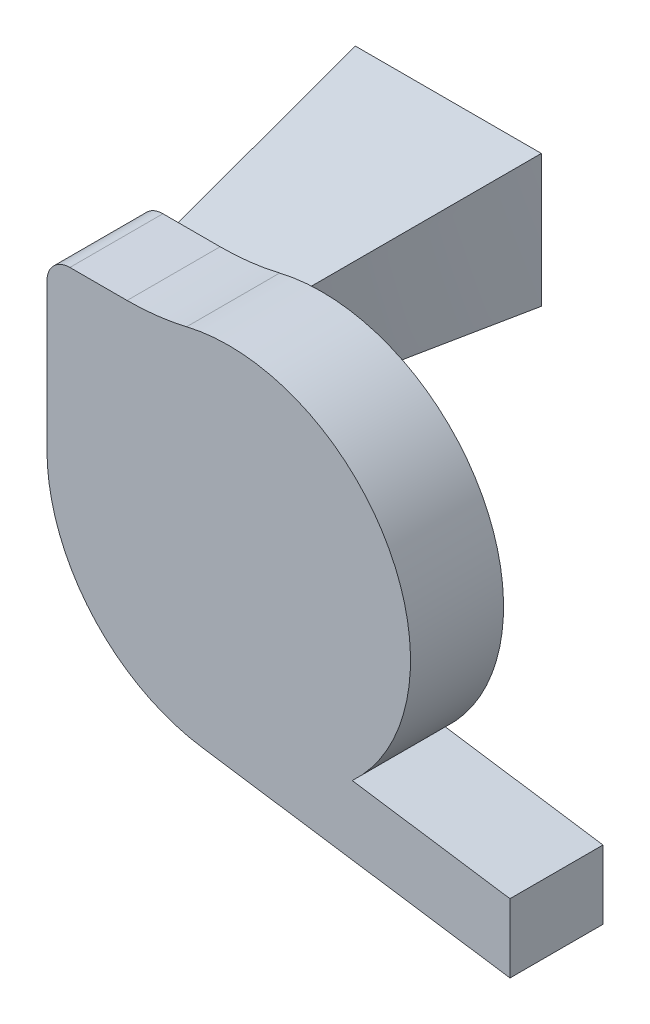
ISO-10303-21;
HEADER;
FILE_DESCRIPTION(('STEP AP214'),'2;1');
FILE_NAME('part.step','',(''),(''),'','','');
FILE_SCHEMA(('AUTOMOTIVE_DESIGN { 1 0 10303 214 1 1 1 1 }'));
ENDSEC;
DATA;
#1=APPLICATION_CONTEXT('core data for automotive mechanical design processes');
#2=APPLICATION_PROTOCOL_DEFINITION('international standard','automotive_design',2000,#1);
#3=PRODUCT_CONTEXT('',#1,'mechanical');
#4=PRODUCT('Part','Part','',(#3));
#5=PRODUCT_RELATED_PRODUCT_CATEGORY('part','',(#4));
#6=PRODUCT_DEFINITION_FORMATION('','',#4);
#7=PRODUCT_DEFINITION_CONTEXT('part definition',#1,'design');
#8=PRODUCT_DEFINITION('design','',#6,#7);
#9=PRODUCT_DEFINITION_SHAPE('','',#8);
#10=(LENGTH_UNIT() NAMED_UNIT(*) SI_UNIT(.MILLI.,.METRE.));
#11=(NAMED_UNIT(*) PLANE_ANGLE_UNIT() SI_UNIT($,.RADIAN.));
#12=(NAMED_UNIT(*) SI_UNIT($,.STERADIAN.) SOLID_ANGLE_UNIT());
#13=UNCERTAINTY_MEASURE_WITH_UNIT(LENGTH_MEASURE(1.E-05),#10,'distance_accuracy_value','');
#14=(GEOMETRIC_REPRESENTATION_CONTEXT(3) GLOBAL_UNCERTAINTY_ASSIGNED_CONTEXT((#13)) GLOBAL_UNIT_ASSIGNED_CONTEXT((#10,
#11,#12)) REPRESENTATION_CONTEXT('',''));
#15=CARTESIAN_POINT('',(0.,0.,0.));
#16=DIRECTION('',(0.,0.,1.));
#17=DIRECTION('',(1.,0.,0.));
#18=AXIS2_PLACEMENT_3D('',#15,#16,#17);
#19=CARTESIAN_POINT('',(128.,-103.,707.));
#20=DIRECTION('',(0.,0.,-1.));
#21=DIRECTION('',(-1.,0.,0.));
#22=AXIS2_PLACEMENT_3D('',#19,#20,#21);
#23=PLANE('',#22);
#24=DIRECTION('',(0.,-1.,0.));
#25=VECTOR('',#24,1.);
#26=CARTESIAN_POINT('',(521.006513991805,-418.097434556668,707.));
#27=LINE('',#26,#25);
#28=CARTESIAN_POINT('',(521.006513991806,-322.097434556668,707.));
#29=VERTEX_POINT('',#28);
#30=CARTESIAN_POINT('',(521.006513991805,-418.097434556668,707.));
#31=VERTEX_POINT('',#30);
#32=EDGE_CURVE('E262',#29,#31,#27,.T.);
#33=ORIENTED_EDGE('',*,*,#32,.T.);
#34=DIRECTION('',(-0.989169442590769,0.146778110918038,0.));
#35=VECTOR('',#34,1.);
#36=CARTESIAN_POINT('',(90.7183598268185,-354.249038418055,707.));
#37=LINE('',#36,#35);
#38=CARTESIAN_POINT('',(90.7183598268185,-354.249038418055,707.));
#39=VERTEX_POINT('',#38);
#40=EDGE_CURVE('E266',#31,#39,#37,.T.);
#41=ORIENTED_EDGE('',*,*,#40,.T.);
#42=CARTESIAN_POINT('',(128.,-103.,707.));
#43=DIRECTION('',(0.,0.,-1.));
#44=DIRECTION('',(-1.,0.,0.));
#45=AXIS2_PLACEMENT_3D('',#42,#43,#44);
#46=CIRCLE('',#45,254.);
#47=CARTESIAN_POINT('',(-126.,-103.,707.));
#48=VERTEX_POINT('',#47);
#49=EDGE_CURVE('E271',#39,#48,#46,.T.);
#50=ORIENTED_EDGE('',*,*,#49,.T.);
#51=DIRECTION('',(0.,1.,0.));
#52=VECTOR('',#51,1.);
#53=CARTESIAN_POINT('',(-126.,-103.,707.));
#54=LINE('',#53,#52);
#55=CARTESIAN_POINT('',(-126.,102.31037281145,707.));
#56=VERTEX_POINT('',#55);
#57=EDGE_CURVE('E275',#48,#56,#54,.T.);
#58=ORIENTED_EDGE('',*,*,#57,.T.);
#59=CARTESIAN_POINT('',(-94.,102.31037281145,707.));
#60=DIRECTION('',(0.,0.,-1.));
#61=DIRECTION('',(-1.,0.,0.));
#62=AXIS2_PLACEMENT_3D('',#59,#60,#61);
#63=CIRCLE('',#62,32.);
#64=CARTESIAN_POINT('',(-94.,134.31037281145,707.));
#65=VERTEX_POINT('',#64);
#66=EDGE_CURVE('E279',#56,#65,#63,.T.);
#67=ORIENTED_EDGE('',*,*,#66,.T.);
#68=DIRECTION('',(1.,0.,0.));
#69=VECTOR('',#68,1.);
#70=CARTESIAN_POINT('',(-94.,134.31037281145,707.));
#71=LINE('',#70,#69);
#72=CARTESIAN_POINT('',(-14.0739402088401,134.31037281145,707.));
#73=VERTEX_POINT('',#72);
#74=EDGE_CURVE('E283',#65,#73,#71,.T.);
#75=ORIENTED_EDGE('',*,*,#74,.T.);
#76=CARTESIAN_POINT('',(-14.07394020884,493.372243845825,707.));
#77=DIRECTION('',(0.,0.,1.));
#78=DIRECTION('',(1.,0.,0.));
#79=AXIS2_PLACEMENT_3D('',#76,#77,#78);
#80=CIRCLE('',#79,359.061871034375);
#81=CARTESIAN_POINT('',(69.1368044270006,144.08525695989,707.));
#82=VERTEX_POINT('',#81);
#83=EDGE_CURVE('E287',#73,#82,#80,.T.);
#84=ORIENTED_EDGE('',*,*,#83,.T.);
#85=CARTESIAN_POINT('',(128.,-103.,707.));
#86=DIRECTION('',(0.,0.,-1.));
#87=DIRECTION('',(-1.,0.,0.));
#88=AXIS2_PLACEMENT_3D('',#85,#86,#87);
#89=CIRCLE('',#88,254.);
#90=CARTESIAN_POINT('',(300.557862014574,-289.386116052026,707.));
#91=VERTEX_POINT('',#90);
#92=EDGE_CURVE('E234',#82,#91,#89,.T.);
#93=ORIENTED_EDGE('',*,*,#92,.T.);
#94=DIRECTION('',(0.989169442590769,-0.146778110918038,0.));
#95=VECTOR('',#94,1.);
#96=CARTESIAN_POINT('',(521.006513991806,-322.097434556668,707.));
#97=LINE('',#96,#95);
#98=EDGE_CURVE('E292',#91,#29,#97,.T.);
#99=ORIENTED_EDGE('',*,*,#98,.T.);
#100=EDGE_LOOP('',(#33,#41,#50,#58,#67,#75,#84,#93,#99));
#101=FACE_BOUND('',#100,.T.);
#102=DIRECTION('',(-1.,0.,0.));
#103=VECTOR('',#102,1.);
#104=CARTESIAN_POINT('',(44.8216487915123,-38.2997440494397,707.));
#105=LINE('',#104,#103);
#106=CARTESIAN_POINT('',(44.8216487915123,-38.2997440494397,707.));
#107=VERTEX_POINT('',#106);
#108=CARTESIAN_POINT('',(-85.1783512084866,-38.2997440494397,707.));
#109=VERTEX_POINT('',#108);
#110=EDGE_CURVE('E315',#107,#109,#105,.T.);
#111=ORIENTED_EDGE('',*,*,#110,.F.);
#112=DIRECTION('',(-0.110431526074847,-0.993883734673619,0.));
#113=VECTOR('',#112,1.);
#114=CARTESIAN_POINT('',(44.8216487915123,-38.2997440494397,707.));
#115=LINE('',#114,#113);
#116=CARTESIAN_POINT('',(59.8216487915123,96.7002559505603,707.));
#117=VERTEX_POINT('',#116);
#118=EDGE_CURVE('E326',#117,#107,#115,.T.);
#119=ORIENTED_EDGE('',*,*,#118,.F.);
#120=DIRECTION('',(1.,0.,0.));
#121=VECTOR('',#120,1.);
#122=CARTESIAN_POINT('',(59.8216487915123,96.7002559505603,707.));
#123=LINE('',#122,#121);
#124=CARTESIAN_POINT('',(-100.178351208487,96.7002559505603,707.));
#125=VERTEX_POINT('',#124);
#126=EDGE_CURVE('E322',#125,#117,#123,.T.);
#127=ORIENTED_EDGE('',*,*,#126,.F.);
#128=DIRECTION('',(-0.110431526074846,0.993883734673619,0.));
#129=VECTOR('',#128,1.);
#130=CARTESIAN_POINT('',(-85.1783512084866,-38.2997440494397,707.));
#131=LINE('',#130,#129);
#132=EDGE_CURVE('E319',#109,#125,#131,.T.);
#133=ORIENTED_EDGE('',*,*,#132,.F.);
#134=EDGE_LOOP('',(#111,#119,#127,#133));
#135=FACE_BOUND('',#134,.T.);
#136=ADVANCED_FACE('F139',(#101,#135),#23,.T.);
#137=CARTESIAN_POINT('',(521.006513991805,-418.097434556668,837.));
#138=DIRECTION('',(1.,0.,0.));
#139=DIRECTION('',(0.,1.,0.));
#140=AXIS2_PLACEMENT_3D('',#137,#138,#139);
#141=PLANE('',#140);
#142=ORIENTED_EDGE('',*,*,#32,.F.);
#143=DIRECTION('',(0.,0.,-1.));
#144=VECTOR('',#143,1.);
#145=CARTESIAN_POINT('',(521.006513991806,-322.097434556668,837.));
#146=LINE('',#145,#144);
#147=CARTESIAN_POINT('',(521.006513991806,-322.097434556668,837.));
#148=VERTEX_POINT('',#147);
#149=EDGE_CURVE('E13',#148,#29,#146,.T.);
#150=ORIENTED_EDGE('',*,*,#149,.F.);
#151=DIRECTION('',(0.,-1.,0.));
#152=VECTOR('',#151,1.);
#153=CARTESIAN_POINT('',(521.006513991805,-418.097434556668,837.));
#154=LINE('',#153,#152);
#155=CARTESIAN_POINT('',(521.006513991805,-418.097434556668,837.));
#156=VERTEX_POINT('',#155);
#157=EDGE_CURVE('E295',#148,#156,#154,.T.);
#158=ORIENTED_EDGE('',*,*,#157,.T.);
#159=DIRECTION('',(0.,0.,-1.));
#160=VECTOR('',#159,1.);
#161=CARTESIAN_POINT('',(521.006513991805,-418.097434556668,837.));
#162=LINE('',#161,#160);
#163=EDGE_CURVE('E206',#156,#31,#162,.T.);
#164=ORIENTED_EDGE('',*,*,#163,.T.);
#165=EDGE_LOOP('',(#142,#150,#158,#164));
#166=FACE_BOUND('',#165,.T.);
#167=ADVANCED_FACE('F141',(#166),#141,.T.);
#168=CARTESIAN_POINT('',(521.006513991806,-322.097434556668,837.));
#169=DIRECTION('',(0.146778110918038,0.989169442590769,0.));
#170=DIRECTION('',(-0.989169442590769,0.146778110918038,0.));
#171=AXIS2_PLACEMENT_3D('',#168,#169,#170);
#172=PLANE('',#171);
#173=ORIENTED_EDGE('',*,*,#98,.F.);
#174=DIRECTION('',(0.,0.,-1.));
#175=VECTOR('',#174,1.);
#176=CARTESIAN_POINT('',(300.557862014574,-289.386116052026,837.));
#177=LINE('',#176,#175);
#178=CARTESIAN_POINT('',(300.557862014574,-289.386116052026,837.));
#179=VERTEX_POINT('',#178);
#180=EDGE_CURVE('E149',#179,#91,#177,.T.);
#181=ORIENTED_EDGE('',*,*,#180,.F.);
#182=DIRECTION('',(0.989169442590769,-0.146778110918038,0.));
#183=VECTOR('',#182,1.);
#184=CARTESIAN_POINT('',(521.006513991806,-322.097434556668,837.));
#185=LINE('',#184,#183);
#186=EDGE_CURVE('E248',#179,#148,#185,.T.);
#187=ORIENTED_EDGE('',*,*,#186,.T.);
#188=ORIENTED_EDGE('',*,*,#149,.T.);
#189=EDGE_LOOP('',(#173,#181,#187,#188));
#190=FACE_BOUND('',#189,.T.);
#191=ADVANCED_FACE('F509',(#190),#172,.T.);
#192=CARTESIAN_POINT('',(128.,-103.,837.));
#193=DIRECTION('',(0.,0.,-1.));
#194=DIRECTION('',(-1.,0.,0.));
#195=AXIS2_PLACEMENT_3D('',#192,#193,#194);
#196=CYLINDRICAL_SURFACE('',#195,254.);
#197=ORIENTED_EDGE('',*,*,#92,.F.);
#198=DIRECTION('',(0.,0.,-1.));
#199=VECTOR('',#198,1.);
#200=CARTESIAN_POINT('',(69.1368044270006,144.08525695989,837.));
#201=LINE('',#200,#199);
#202=CARTESIAN_POINT('',(69.1368044270006,144.08525695989,837.));
#203=VERTEX_POINT('',#202);
#204=EDGE_CURVE('E228',#203,#82,#201,.T.);
#205=ORIENTED_EDGE('',*,*,#204,.F.);
#206=CARTESIAN_POINT('',(128.,-103.,837.));
#207=DIRECTION('',(0.,0.,-1.));
#208=DIRECTION('',(-1.,0.,0.));
#209=AXIS2_PLACEMENT_3D('',#206,#207,#208);
#210=CIRCLE('',#209,254.);
#211=EDGE_CURVE('E231',#203,#179,#210,.T.);
#212=ORIENTED_EDGE('',*,*,#211,.T.);
#213=ORIENTED_EDGE('',*,*,#180,.T.);
#214=EDGE_LOOP('',(#197,#205,#212,#213));
#215=FACE_BOUND('',#214,.T.);
#216=ADVANCED_FACE('F230',(#215),#196,.T.);
#217=CARTESIAN_POINT('',(-14.07394020884,493.372243845825,837.));
#218=DIRECTION('',(0.,0.,-1.));
#219=DIRECTION('',(-1.,0.,0.));
#220=AXIS2_PLACEMENT_3D('',#217,#218,#219);
#221=CYLINDRICAL_SURFACE('',#220,359.061871034375);
#222=ORIENTED_EDGE('',*,*,#83,.F.);
#223=DIRECTION('',(0.,0.,-1.));
#224=VECTOR('',#223,1.);
#225=CARTESIAN_POINT('',(-14.0739402088401,134.31037281145,837.));
#226=LINE('',#225,#224);
#227=CARTESIAN_POINT('',(-14.0739402088401,134.31037281145,837.));
#228=VERTEX_POINT('',#227);
#229=EDGE_CURVE('E240',#228,#73,#226,.T.);
#230=ORIENTED_EDGE('',*,*,#229,.F.);
#231=CARTESIAN_POINT('',(-14.07394020884,493.372243845825,837.));
#232=DIRECTION('',(0.,0.,1.));
#233=DIRECTION('',(1.,0.,0.));
#234=AXIS2_PLACEMENT_3D('',#231,#232,#233);
#235=CIRCLE('',#234,359.061871034375);
#236=EDGE_CURVE('E246',#228,#203,#235,.T.);
#237=ORIENTED_EDGE('',*,*,#236,.T.);
#238=ORIENTED_EDGE('',*,*,#204,.T.);
#239=EDGE_LOOP('',(#222,#230,#237,#238));
#240=FACE_BOUND('',#239,.T.);
#241=ADVANCED_FACE('F251',(#240),#221,.F.);
#242=CARTESIAN_POINT('',(-94.,134.31037281145,837.));
#243=DIRECTION('',(0.,1.,0.));
#244=DIRECTION('',(-1.,0.,0.));
#245=AXIS2_PLACEMENT_3D('',#242,#243,#244);
#246=PLANE('',#245);
#247=ORIENTED_EDGE('',*,*,#74,.F.);
#248=DIRECTION('',(0.,0.,-1.));
#249=VECTOR('',#248,1.);
#250=CARTESIAN_POINT('',(-94.,134.31037281145,837.));
#251=LINE('',#250,#249);
#252=CARTESIAN_POINT('',(-94.,134.31037281145,837.));
#253=VERTEX_POINT('',#252);
#254=EDGE_CURVE('E301',#253,#65,#251,.T.);
#255=ORIENTED_EDGE('',*,*,#254,.F.);
#256=DIRECTION('',(1.,0.,0.));
#257=VECTOR('',#256,1.);
#258=CARTESIAN_POINT('',(-94.,134.31037281145,837.));
#259=LINE('',#258,#257);
#260=EDGE_CURVE('E253',#253,#228,#259,.T.);
#261=ORIENTED_EDGE('',*,*,#260,.T.);
#262=ORIENTED_EDGE('',*,*,#229,.T.);
#263=EDGE_LOOP('',(#247,#255,#261,#262));
#264=FACE_BOUND('',#263,.T.);
#265=ADVANCED_FACE('F511',(#264),#246,.T.);
#266=CARTESIAN_POINT('',(-94.,102.31037281145,837.));
#267=DIRECTION('',(0.,0.,-1.));
#268=DIRECTION('',(-1.,0.,0.));
#269=AXIS2_PLACEMENT_3D('',#266,#267,#268);
#270=CYLINDRICAL_SURFACE('',#269,32.);
#271=ORIENTED_EDGE('',*,*,#66,.F.);
#272=DIRECTION('',(0.,0.,-1.));
#273=VECTOR('',#272,1.);
#274=CARTESIAN_POINT('',(-126.,102.31037281145,837.));
#275=LINE('',#274,#273);
#276=CARTESIAN_POINT('',(-126.,102.31037281145,837.));
#277=VERTEX_POINT('',#276);
#278=EDGE_CURVE('E304',#277,#56,#275,.T.);
#279=ORIENTED_EDGE('',*,*,#278,.F.);
#280=CARTESIAN_POINT('',(-94.,102.31037281145,837.));
#281=DIRECTION('',(0.,0.,-1.));
#282=DIRECTION('',(-1.,0.,0.));
#283=AXIS2_PLACEMENT_3D('',#280,#281,#282);
#284=CIRCLE('',#283,32.);
#285=EDGE_CURVE('E256',#277,#253,#284,.T.);
#286=ORIENTED_EDGE('',*,*,#285,.T.);
#287=ORIENTED_EDGE('',*,*,#254,.T.);
#288=EDGE_LOOP('',(#271,#279,#286,#287));
#289=FACE_BOUND('',#288,.T.);
#290=ADVANCED_FACE('F497',(#289),#270,.T.);
#291=CARTESIAN_POINT('',(-126.,-103.,837.));
#292=DIRECTION('',(-1.,0.,0.));
#293=DIRECTION('',(0.,0.,1.));
#294=AXIS2_PLACEMENT_3D('',#291,#292,#293);
#295=PLANE('',#294);
#296=ORIENTED_EDGE('',*,*,#57,.F.);
#297=DIRECTION('',(0.,0.,-1.));
#298=VECTOR('',#297,1.);
#299=CARTESIAN_POINT('',(-126.,-103.,837.));
#300=LINE('',#299,#298);
#301=CARTESIAN_POINT('',(-126.,-103.,837.));
#302=VERTEX_POINT('',#301);
#303=EDGE_CURVE('E307',#302,#48,#300,.T.);
#304=ORIENTED_EDGE('',*,*,#303,.F.);
#305=DIRECTION('',(0.,1.,0.));
#306=VECTOR('',#305,1.);
#307=CARTESIAN_POINT('',(-126.,-103.,837.));
#308=LINE('',#307,#306);
#309=EDGE_CURVE('E489',#302,#277,#308,.T.);
#310=ORIENTED_EDGE('',*,*,#309,.T.);
#311=ORIENTED_EDGE('',*,*,#278,.T.);
#312=EDGE_LOOP('',(#296,#304,#310,#311));
#313=FACE_BOUND('',#312,.T.);
#314=ADVANCED_FACE('F503',(#313),#295,.T.);
#315=CARTESIAN_POINT('',(128.,-103.,837.));
#316=DIRECTION('',(0.,0.,-1.));
#317=DIRECTION('',(-1.,0.,0.));
#318=AXIS2_PLACEMENT_3D('',#315,#316,#317);
#319=CYLINDRICAL_SURFACE('',#318,254.);
#320=ORIENTED_EDGE('',*,*,#49,.F.);
#321=DIRECTION('',(0.,0.,-1.));
#322=VECTOR('',#321,1.);
#323=CARTESIAN_POINT('',(90.7183598268185,-354.249038418055,837.));
#324=LINE('',#323,#322);
#325=CARTESIAN_POINT('',(90.7183598268185,-354.249038418055,837.));
#326=VERTEX_POINT('',#325);
#327=EDGE_CURVE('E310',#326,#39,#324,.T.);
#328=ORIENTED_EDGE('',*,*,#327,.F.);
#329=CARTESIAN_POINT('',(128.,-103.,837.));
#330=DIRECTION('',(0.,0.,-1.));
#331=DIRECTION('',(-1.,0.,0.));
#332=AXIS2_PLACEMENT_3D('',#329,#330,#331);
#333=CIRCLE('',#332,254.);
#334=EDGE_CURVE('E485',#326,#302,#333,.T.);
#335=ORIENTED_EDGE('',*,*,#334,.T.);
#336=ORIENTED_EDGE('',*,*,#303,.T.);
#337=EDGE_LOOP('',(#320,#328,#335,#336));
#338=FACE_BOUND('',#337,.T.);
#339=ADVANCED_FACE('F506',(#338),#319,.T.);
#340=CARTESIAN_POINT('',(90.7183598268185,-354.249038418055,837.));
#341=DIRECTION('',(-0.146778110918038,-0.989169442590769,0.));
#342=DIRECTION('',(0.989169442590769,-0.146778110918038,0.));
#343=AXIS2_PLACEMENT_3D('',#340,#341,#342);
#344=PLANE('',#343);
#345=ORIENTED_EDGE('',*,*,#40,.F.);
#346=ORIENTED_EDGE('',*,*,#163,.F.);
#347=DIRECTION('',(-0.989169442590769,0.146778110918038,0.));
#348=VECTOR('',#347,1.);
#349=CARTESIAN_POINT('',(90.7183598268185,-354.249038418055,837.));
#350=LINE('',#349,#348);
#351=EDGE_CURVE('E482',#156,#326,#350,.T.);
#352=ORIENTED_EDGE('',*,*,#351,.T.);
#353=ORIENTED_EDGE('',*,*,#327,.T.);
#354=EDGE_LOOP('',(#345,#346,#352,#353));
#355=FACE_BOUND('',#354,.T.);
#356=ADVANCED_FACE('F507',(#355),#344,.T.);
#357=CARTESIAN_POINT('',(128.,-103.,837.));
#358=DIRECTION('',(0.,0.,-1.));
#359=DIRECTION('',(-1.,0.,0.));
#360=AXIS2_PLACEMENT_3D('',#357,#358,#359);
#361=PLANE('',#360);
#362=ORIENTED_EDGE('',*,*,#157,.F.);
#363=ORIENTED_EDGE('',*,*,#186,.F.);
#364=ORIENTED_EDGE('',*,*,#211,.F.);
#365=ORIENTED_EDGE('',*,*,#236,.F.);
#366=ORIENTED_EDGE('',*,*,#260,.F.);
#367=ORIENTED_EDGE('',*,*,#285,.F.);
#368=ORIENTED_EDGE('',*,*,#309,.F.);
#369=ORIENTED_EDGE('',*,*,#334,.F.);
#370=ORIENTED_EDGE('',*,*,#351,.F.);
#371=EDGE_LOOP('',(#362,#363,#364,#365,#366,#367,#368,#369,#370));
#372=FACE_BOUND('',#371,.T.);
#373=ADVANCED_FACE('F244',(#372),#361,.F.);
#374=CARTESIAN_POINT('',(128.,-103.,382.));
#375=DIRECTION('',(0.,0.,1.));
#376=DIRECTION('',(1.,0.,0.));
#377=AXIS2_PLACEMENT_3D('',#374,#375,#376);
#378=PLANE('',#377);
#379=DIRECTION('',(0.,-1.,0.));
#380=VECTOR('',#379,1.);
#381=CARTESIAN_POINT('',(109.821648791513,-38.2997440494397,382.));
#382=LINE('',#381,#380);
#383=CARTESIAN_POINT('',(109.821648791513,146.70025595056,382.));
#384=VERTEX_POINT('',#383);
#385=CARTESIAN_POINT('',(109.821648791513,-38.2997440494397,382.));
#386=VERTEX_POINT('',#385);
#387=EDGE_CURVE('E370',#384,#386,#382,.T.);
#388=ORIENTED_EDGE('',*,*,#387,.T.);
#389=DIRECTION('',(-1.,0.,0.));
#390=VECTOR('',#389,1.);
#391=CARTESIAN_POINT('',(109.821648791513,-38.2997440494397,382.));
#392=LINE('',#391,#390);
#393=CARTESIAN_POINT('',(-150.178351208487,-38.2997440494397,382.));
#394=VERTEX_POINT('',#393);
#395=EDGE_CURVE('E267',#386,#394,#392,.T.);
#396=ORIENTED_EDGE('',*,*,#395,.T.);
#397=DIRECTION('',(0.,1.,0.));
#398=VECTOR('',#397,1.);
#399=CARTESIAN_POINT('',(-150.178351208487,146.70025595056,382.));
#400=LINE('',#399,#398);
#401=CARTESIAN_POINT('',(-150.178351208487,146.70025595056,382.));
#402=VERTEX_POINT('',#401);
#403=EDGE_CURVE('E431',#394,#402,#400,.T.);
#404=ORIENTED_EDGE('',*,*,#403,.T.);
#405=DIRECTION('',(1.,0.,0.));
#406=VECTOR('',#405,1.);
#407=CARTESIAN_POINT('',(109.821648791513,146.70025595056,382.));
#408=LINE('',#407,#406);
#409=EDGE_CURVE('E358',#402,#384,#408,.T.);
#410=ORIENTED_EDGE('',*,*,#409,.T.);
#411=EDGE_LOOP('',(#388,#396,#404,#410));
#412=FACE_BOUND('',#411,.T.);
#413=ADVANCED_FACE('F398',(#412),#378,.F.);
#414=CARTESIAN_POINT('',(128.,-38.2997440494397,731.));
#415=DIRECTION('',(0.,1.,0.));
#416=DIRECTION('',(-1.,0.,0.));
#417=AXIS2_PLACEMENT_3D('',#414,#415,#416);
#418=PLANE('',#417);
#419=DIRECTION('',(-0.196116135138186,0.,-0.98058067569092));
#420=VECTOR('',#419,1.);
#421=CARTESIAN_POINT('',(-85.1783512084866,-38.2997440494397,707.));
#422=LINE('',#421,#420);
#423=EDGE_CURVE('E318',#109,#394,#422,.T.);
#424=ORIENTED_EDGE('',*,*,#423,.T.);
#425=ORIENTED_EDGE('',*,*,#395,.F.);
#426=DIRECTION('',(0.196116135138186,0.,-0.98058067569092));
#427=VECTOR('',#426,1.);
#428=CARTESIAN_POINT('',(44.8216487915123,-38.2997440494397,707.));
#429=LINE('',#428,#427);
#430=EDGE_CURVE('E157',#107,#386,#429,.T.);
#431=ORIENTED_EDGE('',*,*,#430,.F.);
#432=ORIENTED_EDGE('',*,*,#110,.T.);
#433=EDGE_LOOP('',(#424,#425,#431,#432));
#434=FACE_BOUND('',#433,.T.);
#435=ADVANCED_FACE('F388',(#434),#418,.F.);
#436=CARTESIAN_POINT('',(59.8216487915123,96.7002559505603,707.));
#437=CARTESIAN_POINT('',(109.821648791513,146.70025595056,382.));
#438=CARTESIAN_POINT('',(57.3216487915123,74.2002559505603,707.));
#439=CARTESIAN_POINT('',(109.821648791513,115.866922617227,382.));
#440=CARTESIAN_POINT('',(54.8216487915123,51.7002559505603,707.));
#441=CARTESIAN_POINT('',(109.821648791513,85.0335892838936,382.));
#442=CARTESIAN_POINT('',(49.8216487915123,6.70025595056026,707.));
#443=CARTESIAN_POINT('',(109.821648791513,23.3669226172269,382.));
#444=CARTESIAN_POINT('',(47.3216487915123,-15.7997440494397,707.));
#445=CARTESIAN_POINT('',(109.821648791513,-7.46641071610643,382.));
#446=CARTESIAN_POINT('',(44.8216487915123,-38.2997440494397,707.));
#447=CARTESIAN_POINT('',(109.821648791513,-38.2997440494397,382.));
#448=B_SPLINE_SURFACE_WITH_KNOTS('',3,1,((#436,#437),(#438,#439),(#440,#441),(#442,#443),(#444,
#445),(#446,#447)),.UNSPECIFIED.,.F.,.F.,.F.,(4,2,4),(2,2),(0.,0.5,1.),(0.,1.),.UNSPECIFIED.);
#449=DIRECTION('',(0.150329205600567,0.150329205600566,-0.977139836403677));
#450=VECTOR('',#449,1.);
#451=CARTESIAN_POINT('',(59.8216487915123,96.7002559505603,707.));
#452=LINE('',#451,#450);
#453=EDGE_CURVE('E361',#117,#384,#452,.T.);
#454=ORIENTED_EDGE('',*,*,#118,.T.);
#455=ORIENTED_EDGE('',*,*,#430,.T.);
#456=ORIENTED_EDGE('',*,*,#387,.F.);
#457=ORIENTED_EDGE('',*,*,#453,.F.);
#458=EDGE_LOOP('',(#454,#455,#456,#457));
#459=FACE_BOUND('',#458,.T.);
#460=ADVANCED_FACE('F367',(#459),#448,.T.);
#461=CARTESIAN_POINT('',(-85.1783512084866,-38.2997440494397,707.));
#462=CARTESIAN_POINT('',(-150.178351208487,-38.2997440494397,382.));
#463=CARTESIAN_POINT('',(-87.6783512084865,-15.7997440494398,707.));
#464=CARTESIAN_POINT('',(-150.178351208487,-7.46641071610632,382.));
#465=CARTESIAN_POINT('',(-90.1783512084865,6.70025595056017,707.));
#466=CARTESIAN_POINT('',(-150.178351208487,23.3669226172271,382.));
#467=CARTESIAN_POINT('',(-95.1783512084866,51.7002559505602,707.));
#468=CARTESIAN_POINT('',(-150.178351208487,85.0335892838937,382.));
#469=CARTESIAN_POINT('',(-97.6783512084866,74.2002559505602,707.));
#470=CARTESIAN_POINT('',(-150.178351208487,115.866922617227,382.));
#471=CARTESIAN_POINT('',(-100.178351208487,96.7002559505603,707.));
#472=CARTESIAN_POINT('',(-150.178351208487,146.70025595056,382.));
#473=B_SPLINE_SURFACE_WITH_KNOTS('',3,1,((#461,#462),(#463,#464),(#465,#466),(#467,#468),(#469,
#470),(#471,#472)),.UNSPECIFIED.,.F.,.F.,.F.,(4,2,4),(2,2),(0.,0.5,1.),(0.,1.),.UNSPECIFIED.);
#474=DIRECTION('',(-0.150329205600568,0.150329205600566,-0.977139836403677));
#475=VECTOR('',#474,1.);
#476=CARTESIAN_POINT('',(-125.178351208487,121.70025595056,544.5));
#477=LINE('',#476,#475);
#478=EDGE_CURVE('E344',#125,#402,#477,.T.);
#479=ORIENTED_EDGE('',*,*,#132,.T.);
#480=ORIENTED_EDGE('',*,*,#478,.T.);
#481=ORIENTED_EDGE('',*,*,#403,.F.);
#482=ORIENTED_EDGE('',*,*,#423,.F.);
#483=EDGE_LOOP('',(#479,#480,#481,#482));
#484=FACE_BOUND('',#483,.T.);
#485=ADVANCED_FACE('F341',(#484),#473,.T.);
#486=CARTESIAN_POINT('',(128.,88.4759725759809,760.457841934766));
#487=DIRECTION('',(0.,-0.988371697650617,-0.152057184253941));
#488=DIRECTION('',(0.,0.152057184253941,-0.988371697650617));
#489=AXIS2_PLACEMENT_3D('',#486,#487,#488);
#490=PLANE('',#489);
#491=ORIENTED_EDGE('',*,*,#453,.T.);
#492=ORIENTED_EDGE('',*,*,#409,.F.);
#493=ORIENTED_EDGE('',*,*,#478,.F.);
#494=ORIENTED_EDGE('',*,*,#126,.T.);
#495=EDGE_LOOP('',(#491,#492,#493,#494));
#496=FACE_BOUND('',#495,.T.);
#497=ADVANCED_FACE('F355',(#496),#490,.F.);
#498=CLOSED_SHELL('',(#136,#167,#191,#216,#241,#265,#290,#314,#339,#356,#373,#413,#435,#460,
#485,#497));
#499=CARTESIAN_POINT('',(128.,-103.,773.));
#500=DIRECTION('',(0.,0.,-1.));
#501=DIRECTION('',(-1.,0.,0.));
#502=AXIS2_PLACEMENT_3D('',#499,#500,#501);
#503=CYLINDRICAL_SURFACE('',#502,247.);
#504=CARTESIAN_POINT('',(128.,-103.,773.));
#505=DIRECTION('',(0.,0.,-1.));
#506=DIRECTION('',(-1.,0.,0.));
#507=AXIS2_PLACEMENT_3D('',#504,#505,#506);
#508=CIRCLE('',#507,247.);
#509=CARTESIAN_POINT('',(-119.,-103.,773.));
#510=VERTEX_POINT('',#509);
#511=EDGE_CURVE('E331',#510,#510,#508,.T.);
#512=ORIENTED_EDGE('',*,*,#511,.F.);
#513=EDGE_LOOP('',(#512));
#514=FACE_BOUND('',#513,.T.);
#515=CARTESIAN_POINT('',(128.,-103.,725.));
#516=DIRECTION('',(0.,0.,-1.));
#517=DIRECTION('',(-1.,0.,0.));
#518=AXIS2_PLACEMENT_3D('',#515,#516,#517);
#519=CIRCLE('',#518,247.);
#520=CARTESIAN_POINT('',(-119.,-103.,725.));
#521=VERTEX_POINT('',#520);
#522=EDGE_CURVE('E647',#521,#521,#519,.T.);
#523=ORIENTED_EDGE('',*,*,#522,.T.);
#524=EDGE_LOOP('',(#523));
#525=FACE_BOUND('',#524,.T.);
#526=ADVANCED_FACE('F399',(#514,#525),#503,.F.);
#527=CARTESIAN_POINT('',(128.,-103.,773.));
#528=DIRECTION('',(0.,0.,-1.));
#529=DIRECTION('',(-1.,0.,0.));
#530=AXIS2_PLACEMENT_3D('',#527,#528,#529);
#531=PLANE('',#530);
#532=ORIENTED_EDGE('',*,*,#511,.T.);
#533=EDGE_LOOP('',(#532));
#534=FACE_BOUND('',#533,.T.);
#535=ADVANCED_FACE('F618',(#534),#531,.T.);
#536=CARTESIAN_POINT('',(128.,-103.,725.));
#537=DIRECTION('',(0.,0.,-1.));
#538=DIRECTION('',(-1.,0.,0.));
#539=AXIS2_PLACEMENT_3D('',#536,#537,#538);
#540=PLANE('',#539);
#541=ORIENTED_EDGE('',*,*,#522,.F.);
#542=EDGE_LOOP('',(#541));
#543=FACE_BOUND('',#542,.T.);
#544=ADVANCED_FACE('F629',(#543),#540,.F.);
#545=CLOSED_SHELL('',(#526,#535,#544));
#546=ORIENTED_CLOSED_SHELL('',*,#545,.T.);
#547=BREP_WITH_VOIDS('B2',#498,(#546));
#548=ADVANCED_BREP_SHAPE_REPRESENTATION('',(#18,#547),#14);
#549=SHAPE_DEFINITION_REPRESENTATION(#9,#548);
ENDSEC;
END-ISO-10303-21;
